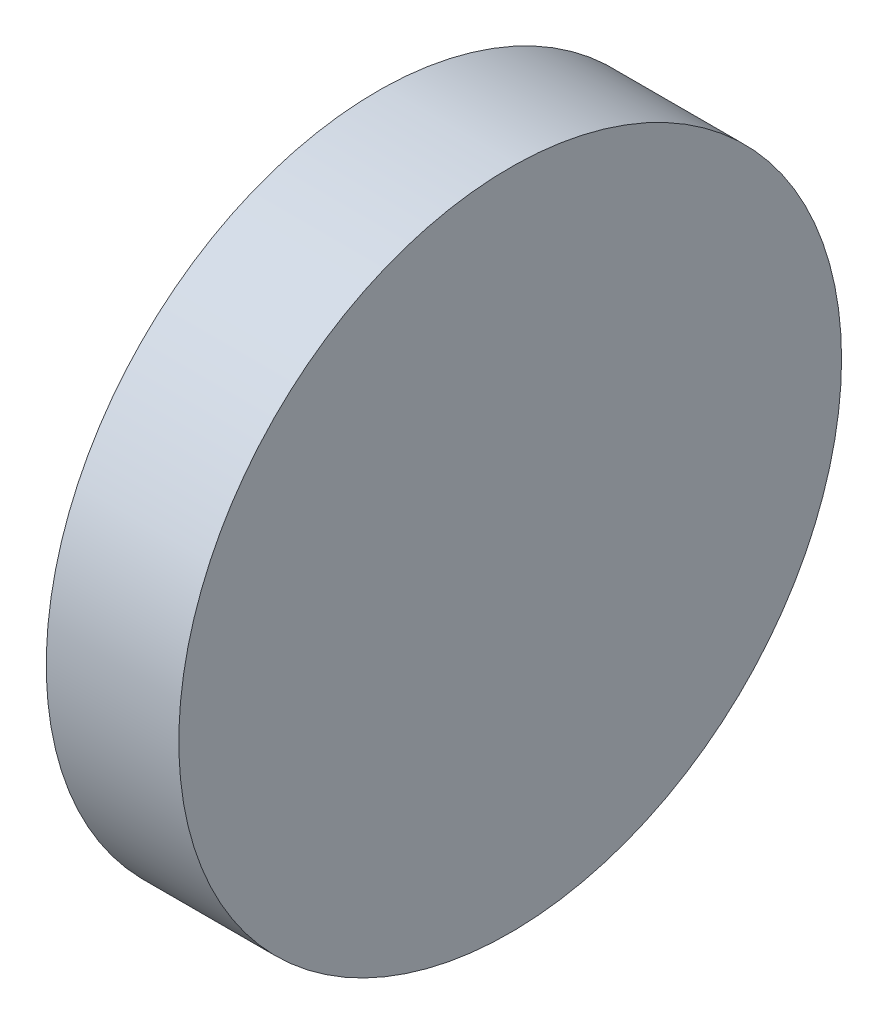
ISO-10303-21;
HEADER;
FILE_DESCRIPTION(('STEP AP214'),'2;1');
FILE_NAME('part.step','',(''),(''),'','','');
FILE_SCHEMA(('AUTOMOTIVE_DESIGN { 1 0 10303 214 1 1 1 1 }'));
ENDSEC;
DATA;
#1=APPLICATION_CONTEXT('core data for automotive mechanical design processes');
#2=APPLICATION_PROTOCOL_DEFINITION('international standard','automotive_design',2000,#1);
#3=PRODUCT_CONTEXT('',#1,'mechanical');
#4=PRODUCT('Part','Part','',(#3));
#5=PRODUCT_RELATED_PRODUCT_CATEGORY('part','',(#4));
#6=PRODUCT_DEFINITION_FORMATION('','',#4);
#7=PRODUCT_DEFINITION_CONTEXT('part definition',#1,'design');
#8=PRODUCT_DEFINITION('design','',#6,#7);
#9=PRODUCT_DEFINITION_SHAPE('','',#8);
#10=(LENGTH_UNIT() NAMED_UNIT(*) SI_UNIT(.MILLI.,.METRE.));
#11=(NAMED_UNIT(*) PLANE_ANGLE_UNIT() SI_UNIT($,.RADIAN.));
#12=(NAMED_UNIT(*) SI_UNIT($,.STERADIAN.) SOLID_ANGLE_UNIT());
#13=UNCERTAINTY_MEASURE_WITH_UNIT(LENGTH_MEASURE(1.E-05),#10,'distance_accuracy_value','');
#14=(GEOMETRIC_REPRESENTATION_CONTEXT(3) GLOBAL_UNCERTAINTY_ASSIGNED_CONTEXT((#13)) GLOBAL_UNIT_ASSIGNED_CONTEXT((#10,
#11,#12)) REPRESENTATION_CONTEXT('',''));
#15=CARTESIAN_POINT('',(0.,0.,0.));
#16=DIRECTION('',(0.,0.,1.));
#17=DIRECTION('',(1.,0.,0.));
#18=AXIS2_PLACEMENT_3D('',#15,#16,#17);
#19=CARTESIAN_POINT('',(5.,0.,0.));
#20=DIRECTION('',(-1.,0.,0.));
#21=DIRECTION('',(0.,0.,1.));
#22=AXIS2_PLACEMENT_3D('',#19,#20,#21);
#23=CYLINDRICAL_SURFACE('',#22,12.5);
#24=CARTESIAN_POINT('',(5.,0.,0.));
#25=DIRECTION('',(1.,0.,0.));
#26=DIRECTION('',(0.,0.,-1.));
#27=AXIS2_PLACEMENT_3D('',#24,#25,#26);
#28=CIRCLE('',#27,12.5);
#29=CARTESIAN_POINT('',(5.,0.,-12.5));
#30=VERTEX_POINT('',#29);
#31=EDGE_CURVE('E10',#30,#30,#28,.T.);
#32=ORIENTED_EDGE('',*,*,#31,.F.);
#33=EDGE_LOOP('',(#32));
#34=FACE_BOUND('',#33,.T.);
#35=CARTESIAN_POINT('',(0.,0.,0.));
#36=DIRECTION('',(1.,0.,0.));
#37=DIRECTION('',(0.,0.,-1.));
#38=AXIS2_PLACEMENT_3D('',#35,#36,#37);
#39=CIRCLE('',#38,12.5);
#40=CARTESIAN_POINT('',(0.,0.,-12.5));
#41=VERTEX_POINT('',#40);
#42=EDGE_CURVE('E35',#41,#41,#39,.T.);
#43=ORIENTED_EDGE('',*,*,#42,.T.);
#44=EDGE_LOOP('',(#43));
#45=FACE_BOUND('',#44,.T.);
#46=ADVANCED_FACE('F32',(#34,#45),#23,.T.);
#47=CARTESIAN_POINT('',(5.,0.,0.));
#48=DIRECTION('',(1.,0.,0.));
#49=DIRECTION('',(0.,0.,-1.));
#50=AXIS2_PLACEMENT_3D('',#47,#48,#49);
#51=PLANE('',#50);
#52=ORIENTED_EDGE('',*,*,#31,.T.);
#53=EDGE_LOOP('',(#52));
#54=FACE_BOUND('',#53,.T.);
#55=ADVANCED_FACE('F47',(#54),#51,.T.);
#56=CARTESIAN_POINT('',(0.,0.,0.));
#57=DIRECTION('',(1.,0.,0.));
#58=DIRECTION('',(0.,0.,-1.));
#59=AXIS2_PLACEMENT_3D('',#56,#57,#58);
#60=PLANE('',#59);
#61=ORIENTED_EDGE('',*,*,#42,.F.);
#62=EDGE_LOOP('',(#61));
#63=FACE_BOUND('',#62,.T.);
#64=ADVANCED_FACE('F45',(#63),#60,.F.);
#65=CLOSED_SHELL('',(#46,#55,#64));
#66=MANIFOLD_SOLID_BREP('B2',#65);
#67=ADVANCED_BREP_SHAPE_REPRESENTATION('',(#18,#66),#14);
#68=SHAPE_DEFINITION_REPRESENTATION(#9,#67);
ENDSEC;
END-ISO-10303-21;
